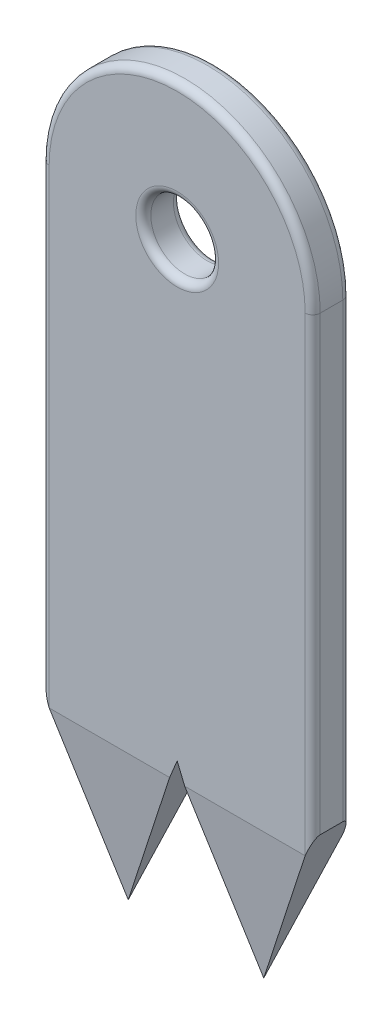
ISO-10303-21;
HEADER;
FILE_DESCRIPTION(('STEP AP214'),'2;1');
FILE_NAME('part.step','',(''),(''),'','','');
FILE_SCHEMA(('AUTOMOTIVE_DESIGN { 1 0 10303 214 1 1 1 1 }'));
ENDSEC;
DATA;
#1=APPLICATION_CONTEXT('core data for automotive mechanical design processes');
#2=APPLICATION_PROTOCOL_DEFINITION('international standard','automotive_design',2000,#1);
#3=PRODUCT_CONTEXT('',#1,'mechanical');
#4=PRODUCT('Part','Part','',(#3));
#5=PRODUCT_RELATED_PRODUCT_CATEGORY('part','',(#4));
#6=PRODUCT_DEFINITION_FORMATION('','',#4);
#7=PRODUCT_DEFINITION_CONTEXT('part definition',#1,'design');
#8=PRODUCT_DEFINITION('design','',#6,#7);
#9=PRODUCT_DEFINITION_SHAPE('','',#8);
#10=(LENGTH_UNIT() NAMED_UNIT(*) SI_UNIT(.MILLI.,.METRE.));
#11=(NAMED_UNIT(*) PLANE_ANGLE_UNIT() SI_UNIT($,.RADIAN.));
#12=(NAMED_UNIT(*) SI_UNIT($,.STERADIAN.) SOLID_ANGLE_UNIT());
#13=UNCERTAINTY_MEASURE_WITH_UNIT(LENGTH_MEASURE(1.E-05),#10,'distance_accuracy_value','');
#14=(GEOMETRIC_REPRESENTATION_CONTEXT(3) GLOBAL_UNCERTAINTY_ASSIGNED_CONTEXT((#13)) GLOBAL_UNIT_ASSIGNED_CONTEXT((#10,
#11,#12)) REPRESENTATION_CONTEXT('',''));
#15=CARTESIAN_POINT('',(0.,0.,0.));
#16=DIRECTION('',(0.,0.,1.));
#17=DIRECTION('',(1.,0.,0.));
#18=AXIS2_PLACEMENT_3D('',#15,#16,#17);
#19=CARTESIAN_POINT('',(-12.7588501154189,52.5652173913044,5.));
#20=DIRECTION('',(0.,0.,1.));
#21=DIRECTION('',(1.,0.,0.));
#22=AXIS2_PLACEMENT_3D('',#19,#20,#21);
#23=PLANE('',#22);
#24=DIRECTION('',(1.,0.,0.));
#25=VECTOR('',#24,1.);
#26=CARTESIAN_POINT('',(-30.7588501154189,-9.84899617106877,5.));
#27=LINE('',#26,#25);
#28=CARTESIAN_POINT('',(-11.7588501154189,-9.84899617106877,5.));
#29=VERTEX_POINT('',#28);
#30=CARTESIAN_POINT('',(4.24114988458109,-9.84899617106877,5.));
#31=VERTEX_POINT('',#30);
#32=EDGE_CURVE('E329',#29,#31,#27,.T.);
#33=ORIENTED_EDGE('',*,*,#32,.T.);
#34=DIRECTION('',(0.,1.,0.));
#35=VECTOR('',#34,1.);
#36=CARTESIAN_POINT('',(4.24114988458108,52.5652173913044,5.));
#37=LINE('',#36,#35);
#38=CARTESIAN_POINT('',(4.24114988458108,52.5652173913044,5.));
#39=VERTEX_POINT('',#38);
#40=EDGE_CURVE('E190',#31,#39,#37,.T.);
#41=ORIENTED_EDGE('',*,*,#40,.T.);
#42=CARTESIAN_POINT('',(-12.7588501154189,52.5652173913044,5.));
#43=DIRECTION('',(0.,0.,1.));
#44=DIRECTION('',(1.,0.,0.));
#45=AXIS2_PLACEMENT_3D('',#42,#43,#44);
#46=CIRCLE('',#45,17.);
#47=CARTESIAN_POINT('',(-29.7588501154189,52.5652173913044,5.));
#48=VERTEX_POINT('',#47);
#49=EDGE_CURVE('E54',#39,#48,#46,.T.);
#50=ORIENTED_EDGE('',*,*,#49,.T.);
#51=DIRECTION('',(0.,-1.,0.));
#52=VECTOR('',#51,1.);
#53=CARTESIAN_POINT('',(-29.7588501154189,-7.43478260869565,5.));
#54=LINE('',#53,#52);
#55=CARTESIAN_POINT('',(-29.7588501154189,-9.84899617106877,5.));
#56=VERTEX_POINT('',#55);
#57=EDGE_CURVE('E188',#48,#56,#54,.T.);
#58=ORIENTED_EDGE('',*,*,#57,.T.);
#59=CARTESIAN_POINT('',(-13.7588501154189,-9.84899617106877,5.));
#60=VERTEX_POINT('',#59);
#61=EDGE_CURVE('E331',#56,#60,#27,.T.);
#62=ORIENTED_EDGE('',*,*,#61,.T.);
#63=DIRECTION('',(0.382683432365087,0.923879532511288,0.));
#64=VECTOR('',#63,1.);
#65=CARTESIAN_POINT('',(-12.7588501154189,-7.43478260869565,5.));
#66=LINE('',#65,#64);
#67=CARTESIAN_POINT('',(-12.7588501154189,-7.43478260869565,5.));
#68=VERTEX_POINT('',#67);
#69=EDGE_CURVE('E215',#60,#68,#66,.T.);
#70=ORIENTED_EDGE('',*,*,#69,.T.);
#71=DIRECTION('',(0.382683432365087,-0.923879532511288,0.));
#72=VECTOR('',#71,1.);
#73=CARTESIAN_POINT('',(-12.7588501154189,-7.43478260869565,5.));
#74=LINE('',#73,#72);
#75=EDGE_CURVE('E217',#68,#29,#74,.T.);
#76=ORIENTED_EDGE('',*,*,#75,.T.);
#77=EDGE_LOOP('',(#33,#41,#50,#58,#62,#70,#76));
#78=FACE_BOUND('',#77,.T.);
#79=CARTESIAN_POINT('',(-12.7588501154189,52.5652173913044,5.));
#80=DIRECTION('',(0.,0.,1.));
#81=DIRECTION('',(1.,0.,0.));
#82=AXIS2_PLACEMENT_3D('',#79,#80,#81);
#83=CIRCLE('',#82,5.5);
#84=CARTESIAN_POINT('',(-7.25885011541891,52.5652173913044,5.));
#85=VERTEX_POINT('',#84);
#86=EDGE_CURVE('E160',#85,#85,#83,.F.);
#87=ORIENTED_EDGE('',*,*,#86,.T.);
#88=EDGE_LOOP('',(#87));
#89=FACE_BOUND('',#88,.T.);
#90=ADVANCED_FACE('F37',(#78,#89),#23,.T.);
#91=CARTESIAN_POINT('',(-12.7588501154189,52.5652173913044,0.));
#92=DIRECTION('',(0.,0.,1.));
#93=DIRECTION('',(1.,0.,0.));
#94=AXIS2_PLACEMENT_3D('',#91,#92,#93);
#95=PLANE('',#94);
#96=CARTESIAN_POINT('',(-12.7588501154189,52.5652173913044,0.));
#97=DIRECTION('',(0.,0.,1.));
#98=DIRECTION('',(1.,0.,0.));
#99=AXIS2_PLACEMENT_3D('',#96,#97,#98);
#100=CIRCLE('',#99,5.5);
#101=CARTESIAN_POINT('',(-7.25885011541891,52.5652173913044,0.));
#102=VERTEX_POINT('',#101);
#103=EDGE_CURVE('E172',#102,#102,#100,.T.);
#104=ORIENTED_EDGE('',*,*,#103,.T.);
#105=EDGE_LOOP('',(#104));
#106=FACE_BOUND('',#105,.T.);
#107=DIRECTION('',(0.,1.,0.));
#108=VECTOR('',#107,1.);
#109=CARTESIAN_POINT('',(4.24114988458108,52.5652173913044,0.));
#110=LINE('',#109,#108);
#111=CARTESIAN_POINT('',(4.24114988458108,52.5652173913044,0.));
#112=VERTEX_POINT('',#111);
#113=CARTESIAN_POINT('',(4.24114988458109,-9.84899617106877,0.));
#114=VERTEX_POINT('',#113);
#115=EDGE_CURVE('E167',#112,#114,#110,.F.);
#116=ORIENTED_EDGE('',*,*,#115,.T.);
#117=DIRECTION('',(1.,0.,0.));
#118=VECTOR('',#117,1.);
#119=CARTESIAN_POINT('',(-30.7588501154189,-9.84899617106873,0.));
#120=LINE('',#119,#118);
#121=CARTESIAN_POINT('',(-11.7588501154189,-9.84899617106873,0.));
#122=VERTEX_POINT('',#121);
#123=EDGE_CURVE('E150',#122,#114,#120,.T.);
#124=ORIENTED_EDGE('',*,*,#123,.F.);
#125=DIRECTION('',(0.382683432365087,-0.923879532511288,0.));
#126=VECTOR('',#125,1.);
#127=CARTESIAN_POINT('',(-12.7588501154189,-7.43478260869565,0.));
#128=LINE('',#127,#126);
#129=CARTESIAN_POINT('',(-12.7588501154189,-7.43478260869565,0.));
#130=VERTEX_POINT('',#129);
#131=EDGE_CURVE('E218',#130,#122,#128,.T.);
#132=ORIENTED_EDGE('',*,*,#131,.F.);
#133=DIRECTION('',(0.382683432365087,0.923879532511288,0.));
#134=VECTOR('',#133,1.);
#135=CARTESIAN_POINT('',(-12.7588501154189,-7.43478260869565,0.));
#136=LINE('',#135,#134);
#137=CARTESIAN_POINT('',(-13.7588501154189,-9.84899617106873,0.));
#138=VERTEX_POINT('',#137);
#139=EDGE_CURVE('E149',#138,#130,#136,.T.);
#140=ORIENTED_EDGE('',*,*,#139,.F.);
#141=CARTESIAN_POINT('',(-29.7588501154189,-9.84899617106873,0.));
#142=VERTEX_POINT('',#141);
#143=EDGE_CURVE('E133',#142,#138,#120,.T.);
#144=ORIENTED_EDGE('',*,*,#143,.F.);
#145=DIRECTION('',(0.,-1.,0.));
#146=VECTOR('',#145,1.);
#147=CARTESIAN_POINT('',(-29.7588501154189,52.5652173913044,0.));
#148=LINE('',#147,#146);
#149=CARTESIAN_POINT('',(-29.7588501154189,52.5652173913044,0.));
#150=VERTEX_POINT('',#149);
#151=EDGE_CURVE('E146',#142,#150,#148,.F.);
#152=ORIENTED_EDGE('',*,*,#151,.T.);
#153=CARTESIAN_POINT('',(-12.7588501154189,52.5652173913044,0.));
#154=DIRECTION('',(0.,0.,1.));
#155=DIRECTION('',(1.,0.,0.));
#156=AXIS2_PLACEMENT_3D('',#153,#154,#155);
#157=CIRCLE('',#156,17.);
#158=EDGE_CURVE('E168',#150,#112,#157,.F.);
#159=ORIENTED_EDGE('',*,*,#158,.T.);
#160=EDGE_LOOP('',(#116,#124,#132,#140,#144,#152,#159));
#161=FACE_BOUND('',#160,.T.);
#162=ADVANCED_FACE('F144',(#106,#161),#95,.F.);
#163=CARTESIAN_POINT('',(-12.7588501154189,-7.43478260869565,5.));
#164=DIRECTION('',(-0.923879532511288,0.382683432365087,0.));
#165=DIRECTION('',(-0.382683432365087,-0.923879532511288,0.));
#166=AXIS2_PLACEMENT_3D('',#163,#164,#165);
#167=PLANE('',#166);
#168=DIRECTION('',(-0.379975978808354,-0.917343161415128,-0.118742493377611));
#169=VECTOR('',#168,1.);
#170=CARTESIAN_POINT('',(-12.7729498951524,-7.46882248815482,5.30809381883327));
#171=LINE('',#170,#169);
#172=CARTESIAN_POINT('',(-21.7588501154189,-29.1627046700537,2.5));
#173=VERTEX_POINT('',#172);
#174=EDGE_CURVE('E211',#60,#173,#171,.T.);
#175=ORIENTED_EDGE('',*,*,#174,.T.);
#176=DIRECTION('',(0.379975978808354,0.917343161415128,-0.118742493377611));
#177=VECTOR('',#176,1.);
#178=CARTESIAN_POINT('',(-12.9985463708889,-8.01346055950148,-0.237594920165608));
#179=LINE('',#178,#177);
#180=EDGE_CURVE('E135',#173,#138,#179,.T.);
#181=ORIENTED_EDGE('',*,*,#180,.T.);
#182=ORIENTED_EDGE('',*,*,#139,.T.);
#183=DIRECTION('',(0.,0.,-1.));
#184=VECTOR('',#183,1.);
#185=CARTESIAN_POINT('',(-12.7588501154189,-7.43478260869565,5.));
#186=LINE('',#185,#184);
#187=EDGE_CURVE('E233',#68,#130,#186,.T.);
#188=ORIENTED_EDGE('',*,*,#187,.F.);
#189=ORIENTED_EDGE('',*,*,#69,.F.);
#190=EDGE_LOOP('',(#175,#181,#182,#188,#189));
#191=FACE_BOUND('',#190,.T.);
#192=ADVANCED_FACE('F263',(#191),#167,.F.);
#193=CARTESIAN_POINT('',(-12.7588501154189,-7.43478260869565,5.));
#194=DIRECTION('',(0.923879532511288,0.382683432365087,0.));
#195=DIRECTION('',(-0.382683432365087,0.923879532511288,0.));
#196=AXIS2_PLACEMENT_3D('',#193,#194,#195);
#197=PLANE('',#196);
#198=ORIENTED_EDGE('',*,*,#131,.T.);
#199=DIRECTION('',(0.379975978808354,-0.917343161415128,0.118742493377611));
#200=VECTOR('',#199,1.);
#201=CARTESIAN_POINT('',(-12.5191538599489,-8.01346055950148,-0.237594920165608));
#202=LINE('',#201,#200);
#203=CARTESIAN_POINT('',(-3.7588501154189,-29.1627046700537,2.5));
#204=VERTEX_POINT('',#203);
#205=EDGE_CURVE('E332',#122,#204,#202,.T.);
#206=ORIENTED_EDGE('',*,*,#205,.T.);
#207=DIRECTION('',(-0.379975978808354,0.917343161415128,0.118742493377611));
#208=VECTOR('',#207,1.);
#209=CARTESIAN_POINT('',(-12.7447503356854,-7.46882248815482,5.30809381883327));
#210=LINE('',#209,#208);
#211=EDGE_CURVE('E200',#204,#29,#210,.T.);
#212=ORIENTED_EDGE('',*,*,#211,.T.);
#213=ORIENTED_EDGE('',*,*,#75,.F.);
#214=ORIENTED_EDGE('',*,*,#187,.T.);
#215=EDGE_LOOP('',(#198,#206,#212,#213,#214));
#216=FACE_BOUND('',#215,.T.);
#217=ADVANCED_FACE('F288',(#216),#197,.F.);
#218=CARTESIAN_POINT('',(-3.7588501154189,-29.1627046700537,5.));
#219=DIRECTION('',(-0.923879532511288,0.382683432365087,0.));
#220=DIRECTION('',(-0.382683432365087,-0.923879532511288,0.));
#221=AXIS2_PLACEMENT_3D('',#218,#219,#220);
#222=PLANE('',#221);
#223=DIRECTION('',(-0.379975978808354,-0.917343161415128,-0.118742493377611));
#224=VECTOR('',#223,1.);
#225=CARTESIAN_POINT('',(-3.64605187755065,-28.8903856343803,2.53524944933383));
#226=LINE('',#225,#224);
#227=EDGE_CURVE('E203',#31,#204,#226,.T.);
#228=ORIENTED_EDGE('',*,*,#227,.T.);
#229=DIRECTION('',(0.379975978808354,0.917343161415128,-0.118742493377611));
#230=VECTOR('',#229,1.);
#231=CARTESIAN_POINT('',(-3.87164835328716,-29.435023705727,2.53524944933383));
#232=LINE('',#231,#230);
#233=EDGE_CURVE('E326',#204,#114,#232,.T.);
#234=ORIENTED_EDGE('',*,*,#233,.T.);
#235=CARTESIAN_POINT('',(4.24114988458109,-9.84899617106876,1.));
#236=DIRECTION('',(-0.923879532511288,0.382683432365087,0.));
#237=DIRECTION('',(0.382683432365087,0.923879532511288,0.));
#238=AXIS2_PLACEMENT_3D('',#235,#236,#237);
#239=ELLIPSE('',#238,2.61312592975277,1.);
#240=CARTESIAN_POINT('',(5.24114988458109,-7.43478260869565,1.));
#241=VERTEX_POINT('',#240);
#242=EDGE_CURVE('E178',#114,#241,#239,.F.);
#243=ORIENTED_EDGE('',*,*,#242,.T.);
#244=DIRECTION('',(0.,0.,-1.));
#245=VECTOR('',#244,1.);
#246=CARTESIAN_POINT('',(5.24114988458109,-7.43478260869565,5.));
#247=LINE('',#246,#245);
#248=CARTESIAN_POINT('',(5.24114988458109,-7.43478260869565,4.));
#249=VERTEX_POINT('',#248);
#250=EDGE_CURVE('E230',#249,#241,#247,.T.);
#251=ORIENTED_EDGE('',*,*,#250,.F.);
#252=CARTESIAN_POINT('',(4.24114988458109,-9.84899617106876,4.));
#253=DIRECTION('',(-0.923879532511288,0.382683432365087,0.));
#254=DIRECTION('',(-0.382683432365087,-0.923879532511288,0.));
#255=AXIS2_PLACEMENT_3D('',#252,#253,#254);
#256=ELLIPSE('',#255,2.61312592975277,1.);
#257=EDGE_CURVE('E170',#249,#31,#256,.F.);
#258=ORIENTED_EDGE('',*,*,#257,.T.);
#259=EDGE_LOOP('',(#228,#234,#243,#251,#258));
#260=FACE_BOUND('',#259,.T.);
#261=ADVANCED_FACE('F284',(#260),#222,.F.);
#262=CARTESIAN_POINT('',(5.24114988458109,52.5652173913044,5.));
#263=DIRECTION('',(-1.,0.,0.));
#264=DIRECTION('',(0.,-1.,0.));
#265=AXIS2_PLACEMENT_3D('',#262,#263,#264);
#266=PLANE('',#265);
#267=ORIENTED_EDGE('',*,*,#250,.T.);
#268=DIRECTION('',(0.,1.,0.));
#269=VECTOR('',#268,1.);
#270=CARTESIAN_POINT('',(5.24114988458109,52.5652173913044,1.));
#271=LINE('',#270,#269);
#272=CARTESIAN_POINT('',(5.24114988458108,52.5652173913044,1.));
#273=VERTEX_POINT('',#272);
#274=EDGE_CURVE('E238',#241,#273,#271,.T.);
#275=ORIENTED_EDGE('',*,*,#274,.T.);
#276=DIRECTION('',(0.,0.,-1.));
#277=VECTOR('',#276,1.);
#278=CARTESIAN_POINT('',(5.24114988458108,52.5652173913044,5.));
#279=LINE('',#278,#277);
#280=CARTESIAN_POINT('',(5.24114988458108,52.5652173913044,4.));
#281=VERTEX_POINT('',#280);
#282=EDGE_CURVE('E227',#281,#273,#279,.T.);
#283=ORIENTED_EDGE('',*,*,#282,.F.);
#284=DIRECTION('',(0.,1.,0.));
#285=VECTOR('',#284,1.);
#286=CARTESIAN_POINT('',(5.24114988458109,-7.43478260869565,4.));
#287=LINE('',#286,#285);
#288=EDGE_CURVE('E236',#281,#249,#287,.F.);
#289=ORIENTED_EDGE('',*,*,#288,.T.);
#290=EDGE_LOOP('',(#267,#275,#283,#289));
#291=FACE_BOUND('',#290,.T.);
#292=ADVANCED_FACE('F280',(#291),#266,.F.);
#293=CARTESIAN_POINT('',(-12.7588501154189,52.5652173913044,5.));
#294=DIRECTION('',(0.,0.,-1.));
#295=DIRECTION('',(-1.,0.,0.));
#296=AXIS2_PLACEMENT_3D('',#293,#294,#295);
#297=CYLINDRICAL_SURFACE('',#296,18.);
#298=ORIENTED_EDGE('',*,*,#282,.T.);
#299=CARTESIAN_POINT('',(-12.7588501154189,52.5652173913044,1.));
#300=DIRECTION('',(0.,0.,1.));
#301=DIRECTION('',(1.,0.,0.));
#302=AXIS2_PLACEMENT_3D('',#299,#300,#301);
#303=CIRCLE('',#302,18.);
#304=CARTESIAN_POINT('',(-30.7588501154189,52.5652173913044,1.));
#305=VERTEX_POINT('',#304);
#306=EDGE_CURVE('E194',#273,#305,#303,.T.);
#307=ORIENTED_EDGE('',*,*,#306,.T.);
#308=DIRECTION('',(0.,0.,-1.));
#309=VECTOR('',#308,1.);
#310=CARTESIAN_POINT('',(-30.7588501154189,52.5652173913044,5.));
#311=LINE('',#310,#309);
#312=CARTESIAN_POINT('',(-30.7588501154189,52.5652173913044,4.));
#313=VERTEX_POINT('',#312);
#314=EDGE_CURVE('E224',#313,#305,#311,.T.);
#315=ORIENTED_EDGE('',*,*,#314,.F.);
#316=CARTESIAN_POINT('',(-12.7588501154189,52.5652173913044,4.));
#317=DIRECTION('',(0.,0.,1.));
#318=DIRECTION('',(1.,0.,0.));
#319=AXIS2_PLACEMENT_3D('',#316,#317,#318);
#320=CIRCLE('',#319,18.);
#321=EDGE_CURVE('E192',#313,#281,#320,.F.);
#322=ORIENTED_EDGE('',*,*,#321,.T.);
#323=EDGE_LOOP('',(#298,#307,#315,#322));
#324=FACE_BOUND('',#323,.T.);
#325=ADVANCED_FACE('F276',(#324),#297,.T.);
#326=CARTESIAN_POINT('',(-30.7588501154189,-7.43478260869565,5.));
#327=DIRECTION('',(1.,0.,0.));
#328=DIRECTION('',(0.,0.,-1.));
#329=AXIS2_PLACEMENT_3D('',#326,#327,#328);
#330=PLANE('',#329);
#331=ORIENTED_EDGE('',*,*,#314,.T.);
#332=DIRECTION('',(0.,-1.,0.));
#333=VECTOR('',#332,1.);
#334=CARTESIAN_POINT('',(-30.7588501154189,-7.43478260869565,1.));
#335=LINE('',#334,#333);
#336=CARTESIAN_POINT('',(-30.7588501154189,-7.43478260869565,1.));
#337=VERTEX_POINT('',#336);
#338=EDGE_CURVE('E182',#305,#337,#335,.T.);
#339=ORIENTED_EDGE('',*,*,#338,.T.);
#340=DIRECTION('',(0.,0.,-1.));
#341=VECTOR('',#340,1.);
#342=CARTESIAN_POINT('',(-30.7588501154189,-7.43478260869565,5.));
#343=LINE('',#342,#341);
#344=CARTESIAN_POINT('',(-30.7588501154189,-7.43478260869565,4.));
#345=VERTEX_POINT('',#344);
#346=EDGE_CURVE('E157',#345,#337,#343,.T.);
#347=ORIENTED_EDGE('',*,*,#346,.F.);
#348=DIRECTION('',(0.,-1.,0.));
#349=VECTOR('',#348,1.);
#350=CARTESIAN_POINT('',(-30.7588501154189,52.5652173913044,4.));
#351=LINE('',#350,#349);
#352=EDGE_CURVE('E180',#345,#313,#351,.F.);
#353=ORIENTED_EDGE('',*,*,#352,.T.);
#354=EDGE_LOOP('',(#331,#339,#347,#353));
#355=FACE_BOUND('',#354,.T.);
#356=ADVANCED_FACE('F273',(#355),#330,.F.);
#357=CARTESIAN_POINT('',(-21.7588501154189,-29.1627046700537,5.));
#358=DIRECTION('',(0.923879532511288,0.382683432365087,0.));
#359=DIRECTION('',(-0.382683432365087,0.923879532511288,0.));
#360=AXIS2_PLACEMENT_3D('',#357,#358,#359);
#361=PLANE('',#360);
#362=CARTESIAN_POINT('',(-29.7588501154189,-9.84899617106876,1.));
#363=DIRECTION('',(0.923879532511288,0.382683432365087,0.));
#364=DIRECTION('',(0.382683432365087,-0.923879532511288,0.));
#365=AXIS2_PLACEMENT_3D('',#362,#363,#364);
#366=ELLIPSE('',#365,2.61312592975277,1.);
#367=EDGE_CURVE('E154',#337,#142,#366,.F.);
#368=ORIENTED_EDGE('',*,*,#367,.T.);
#369=DIRECTION('',(0.379975978808354,-0.917343161415128,0.118742493377611));
#370=VECTOR('',#369,1.);
#371=CARTESIAN_POINT('',(-21.6460518775507,-29.435023705727,2.53524944933383));
#372=LINE('',#371,#370);
#373=EDGE_CURVE('E130',#142,#173,#372,.T.);
#374=ORIENTED_EDGE('',*,*,#373,.T.);
#375=DIRECTION('',(-0.379975978808354,0.917343161415128,0.118742493377611));
#376=VECTOR('',#375,1.);
#377=CARTESIAN_POINT('',(-21.8716483532872,-28.8903856343803,2.53524944933383));
#378=LINE('',#377,#376);
#379=EDGE_CURVE('E315',#173,#56,#378,.T.);
#380=ORIENTED_EDGE('',*,*,#379,.T.);
#381=CARTESIAN_POINT('',(-29.7588501154189,-9.84899617106877,4.));
#382=DIRECTION('',(0.923879532511288,0.382683432365087,0.));
#383=DIRECTION('',(-0.382683432365087,0.923879532511288,0.));
#384=AXIS2_PLACEMENT_3D('',#381,#382,#383);
#385=ELLIPSE('',#384,2.61312592975277,1.);
#386=EDGE_CURVE('E161',#56,#345,#385,.F.);
#387=ORIENTED_EDGE('',*,*,#386,.T.);
#388=ORIENTED_EDGE('',*,*,#346,.T.);
#389=EDGE_LOOP('',(#368,#374,#380,#387,#388));
#390=FACE_BOUND('',#389,.T.);
#391=ADVANCED_FACE('F155',(#390),#361,.F.);
#392=CARTESIAN_POINT('',(-12.7588501154189,52.5652173913044,5.));
#393=DIRECTION('',(0.,0.,-1.));
#394=DIRECTION('',(-1.,0.,0.));
#395=AXIS2_PLACEMENT_3D('',#392,#393,#394);
#396=CYLINDRICAL_SURFACE('',#395,4.5);
#397=CARTESIAN_POINT('',(-12.7588501154189,52.5652173913044,1.));
#398=DIRECTION('',(0.,0.,1.));
#399=DIRECTION('',(1.,0.,0.));
#400=AXIS2_PLACEMENT_3D('',#397,#398,#399);
#401=CIRCLE('',#400,4.5);
#402=CARTESIAN_POINT('',(-8.25885011541891,52.5652173913044,1.));
#403=VERTEX_POINT('',#402);
#404=EDGE_CURVE('E11',#403,#403,#401,.F.);
#405=ORIENTED_EDGE('',*,*,#404,.T.);
#406=EDGE_LOOP('',(#405));
#407=FACE_BOUND('',#406,.T.);
#408=CARTESIAN_POINT('',(-12.7588501154189,52.5652173913044,4.));
#409=DIRECTION('',(0.,0.,1.));
#410=DIRECTION('',(1.,0.,0.));
#411=AXIS2_PLACEMENT_3D('',#408,#409,#410);
#412=CIRCLE('',#411,4.5);
#413=CARTESIAN_POINT('',(-8.25885011541891,52.5652173913044,4.));
#414=VERTEX_POINT('',#413);
#415=EDGE_CURVE('E46',#414,#414,#412,.T.);
#416=ORIENTED_EDGE('',*,*,#415,.T.);
#417=EDGE_LOOP('',(#416));
#418=FACE_BOUND('',#417,.T.);
#419=ADVANCED_FACE('F268',(#407,#418),#396,.F.);
#420=CARTESIAN_POINT('',(-29.7588501154189,-7.43478260869565,1.));
#421=DIRECTION('',(0.,-1.,0.));
#422=DIRECTION('',(0.,0.,-1.));
#423=AXIS2_PLACEMENT_3D('',#420,#421,#422);
#424=CYLINDRICAL_SURFACE('',#423,1.);
#425=ORIENTED_EDGE('',*,*,#367,.F.);
#426=ORIENTED_EDGE('',*,*,#338,.F.);
#427=CARTESIAN_POINT('',(-29.7588501154189,52.5652173913044,1.));
#428=DIRECTION('',(0.,1.,0.));
#429=DIRECTION('',(0.,0.,1.));
#430=AXIS2_PLACEMENT_3D('',#427,#428,#429);
#431=CIRCLE('',#430,1.);
#432=EDGE_CURVE('E165',#150,#305,#431,.T.);
#433=ORIENTED_EDGE('',*,*,#432,.F.);
#434=ORIENTED_EDGE('',*,*,#151,.F.);
#435=EDGE_LOOP('',(#425,#426,#433,#434));
#436=FACE_BOUND('',#435,.T.);
#437=ADVANCED_FACE('F163',(#436),#424,.T.);
#438=CARTESIAN_POINT('',(-12.7588501154189,52.5652173913044,1.));
#439=DIRECTION('',(0.,0.,1.));
#440=DIRECTION('',(1.,0.,0.));
#441=AXIS2_PLACEMENT_3D('',#438,#439,#440);
#442=TOROIDAL_SURFACE('',#441,17.,1.);
#443=ORIENTED_EDGE('',*,*,#432,.T.);
#444=ORIENTED_EDGE('',*,*,#306,.F.);
#445=CARTESIAN_POINT('',(4.24114988458108,52.5652173913044,1.));
#446=DIRECTION('',(0.,-1.,0.));
#447=DIRECTION('',(0.,0.,-1.));
#448=AXIS2_PLACEMENT_3D('',#445,#446,#447);
#449=CIRCLE('',#448,1.);
#450=EDGE_CURVE('E198',#112,#273,#449,.T.);
#451=ORIENTED_EDGE('',*,*,#450,.F.);
#452=ORIENTED_EDGE('',*,*,#158,.F.);
#453=EDGE_LOOP('',(#443,#444,#451,#452));
#454=FACE_BOUND('',#453,.T.);
#455=ADVANCED_FACE('F299',(#454),#442,.T.);
#456=CARTESIAN_POINT('',(4.24114988458109,52.5652173913044,1.));
#457=DIRECTION('',(0.,1.,0.));
#458=DIRECTION('',(-1.,0.,0.));
#459=AXIS2_PLACEMENT_3D('',#456,#457,#458);
#460=CYLINDRICAL_SURFACE('',#459,1.);
#461=ORIENTED_EDGE('',*,*,#242,.F.);
#462=ORIENTED_EDGE('',*,*,#115,.F.);
#463=ORIENTED_EDGE('',*,*,#450,.T.);
#464=ORIENTED_EDGE('',*,*,#274,.F.);
#465=EDGE_LOOP('',(#461,#462,#463,#464));
#466=FACE_BOUND('',#465,.T.);
#467=ADVANCED_FACE('F295',(#466),#460,.T.);
#468=CARTESIAN_POINT('',(-29.7588501154189,52.5652173913044,4.));
#469=DIRECTION('',(0.,1.,0.));
#470=DIRECTION('',(0.,0.,1.));
#471=AXIS2_PLACEMENT_3D('',#468,#469,#470);
#472=CYLINDRICAL_SURFACE('',#471,1.);
#473=ORIENTED_EDGE('',*,*,#386,.F.);
#474=ORIENTED_EDGE('',*,*,#57,.F.);
#475=CARTESIAN_POINT('',(-29.7588501154189,52.5652173913044,4.));
#476=DIRECTION('',(0.,1.,0.));
#477=DIRECTION('',(0.,0.,1.));
#478=AXIS2_PLACEMENT_3D('',#475,#476,#477);
#479=CIRCLE('',#478,1.);
#480=EDGE_CURVE('E41',#313,#48,#479,.T.);
#481=ORIENTED_EDGE('',*,*,#480,.F.);
#482=ORIENTED_EDGE('',*,*,#352,.F.);
#483=EDGE_LOOP('',(#473,#474,#481,#482));
#484=FACE_BOUND('',#483,.T.);
#485=ADVANCED_FACE('F298',(#484),#472,.T.);
#486=CARTESIAN_POINT('',(-12.7588501154189,52.5652173913044,4.));
#487=DIRECTION('',(0.,0.,1.));
#488=DIRECTION('',(1.,0.,0.));
#489=AXIS2_PLACEMENT_3D('',#486,#487,#488);
#490=TOROIDAL_SURFACE('',#489,17.,1.);
#491=ORIENTED_EDGE('',*,*,#480,.T.);
#492=ORIENTED_EDGE('',*,*,#49,.F.);
#493=CARTESIAN_POINT('',(4.24114988458108,52.5652173913044,4.));
#494=DIRECTION('',(0.,-1.,0.));
#495=DIRECTION('',(0.,0.,-1.));
#496=AXIS2_PLACEMENT_3D('',#493,#494,#495);
#497=CIRCLE('',#496,1.);
#498=EDGE_CURVE('E62',#281,#39,#497,.T.);
#499=ORIENTED_EDGE('',*,*,#498,.F.);
#500=ORIENTED_EDGE('',*,*,#321,.F.);
#501=EDGE_LOOP('',(#491,#492,#499,#500));
#502=FACE_BOUND('',#501,.T.);
#503=ADVANCED_FACE('F254',(#502),#490,.T.);
#504=CARTESIAN_POINT('',(4.24114988458108,52.5652173913044,4.));
#505=DIRECTION('',(0.,-1.,0.));
#506=DIRECTION('',(1.,0.,0.));
#507=AXIS2_PLACEMENT_3D('',#504,#505,#506);
#508=CYLINDRICAL_SURFACE('',#507,1.);
#509=ORIENTED_EDGE('',*,*,#257,.F.);
#510=ORIENTED_EDGE('',*,*,#288,.F.);
#511=ORIENTED_EDGE('',*,*,#498,.T.);
#512=ORIENTED_EDGE('',*,*,#40,.F.);
#513=EDGE_LOOP('',(#509,#510,#511,#512));
#514=FACE_BOUND('',#513,.T.);
#515=ADVANCED_FACE('F246',(#514),#508,.T.);
#516=CARTESIAN_POINT('',(-12.7588501154189,52.5652173913044,1.));
#517=DIRECTION('',(0.,0.,1.));
#518=DIRECTION('',(1.,0.,0.));
#519=AXIS2_PLACEMENT_3D('',#516,#517,#518);
#520=TOROIDAL_SURFACE('',#519,5.5,1.);
#521=ORIENTED_EDGE('',*,*,#404,.F.);
#522=EDGE_LOOP('',(#521));
#523=FACE_BOUND('',#522,.T.);
#524=ORIENTED_EDGE('',*,*,#103,.F.);
#525=EDGE_LOOP('',(#524));
#526=FACE_BOUND('',#525,.T.);
#527=ADVANCED_FACE('F244',(#523,#526),#520,.T.);
#528=CARTESIAN_POINT('',(-12.7588501154189,52.5652173913044,4.));
#529=DIRECTION('',(0.,0.,1.));
#530=DIRECTION('',(1.,0.,0.));
#531=AXIS2_PLACEMENT_3D('',#528,#529,#530);
#532=TOROIDAL_SURFACE('',#531,5.5,1.);
#533=ORIENTED_EDGE('',*,*,#86,.F.);
#534=EDGE_LOOP('',(#533));
#535=FACE_BOUND('',#534,.T.);
#536=ORIENTED_EDGE('',*,*,#415,.F.);
#537=EDGE_LOOP('',(#536));
#538=FACE_BOUND('',#537,.T.);
#539=ADVANCED_FACE('F39',(#535,#538),#532,.T.);
#540=CARTESIAN_POINT('',(-30.7588501154189,-29.1627046700537,2.5));
#541=DIRECTION('',(0.,0.128370769053769,-0.991726245318003));
#542=DIRECTION('',(0.,0.991726245318003,0.128370769053769));
#543=AXIS2_PLACEMENT_3D('',#540,#541,#542);
#544=PLANE('',#543);
#545=ORIENTED_EDGE('',*,*,#61,.F.);
#546=ORIENTED_EDGE('',*,*,#379,.F.);
#547=ORIENTED_EDGE('',*,*,#174,.F.);
#548=EDGE_LOOP('',(#545,#546,#547));
#549=FACE_BOUND('',#548,.T.);
#550=ADVANCED_FACE('F252',(#549),#544,.F.);
#551=ORIENTED_EDGE('',*,*,#227,.F.);
#552=ORIENTED_EDGE('',*,*,#32,.F.);
#553=ORIENTED_EDGE('',*,*,#211,.F.);
#554=EDGE_LOOP('',(#551,#552,#553));
#555=FACE_BOUND('',#554,.T.);
#556=ADVANCED_FACE('F334',(#555),#544,.F.);
#557=CARTESIAN_POINT('',(-30.7588501154189,-29.1627046700537,2.5));
#558=DIRECTION('',(0.,0.128370769053769,0.991726245318003));
#559=DIRECTION('',(0.,-0.991726245318003,0.128370769053769));
#560=AXIS2_PLACEMENT_3D('',#557,#558,#559);
#561=PLANE('',#560);
#562=ORIENTED_EDGE('',*,*,#373,.F.);
#563=ORIENTED_EDGE('',*,*,#143,.T.);
#564=ORIENTED_EDGE('',*,*,#180,.F.);
#565=EDGE_LOOP('',(#562,#563,#564));
#566=FACE_BOUND('',#565,.T.);
#567=ADVANCED_FACE('F132',(#566),#561,.F.);
#568=ORIENTED_EDGE('',*,*,#123,.T.);
#569=ORIENTED_EDGE('',*,*,#233,.F.);
#570=ORIENTED_EDGE('',*,*,#205,.F.);
#571=EDGE_LOOP('',(#568,#569,#570));
#572=FACE_BOUND('',#571,.T.);
#573=ADVANCED_FACE('F340',(#572),#561,.F.);
#574=CLOSED_SHELL('',(#90,#162,#192,#217,#261,#292,#325,#356,#391,#419,#437,#455,#467,#485,#503,
#515,#527,#539,#550,#556,#567,#573));
#575=MANIFOLD_SOLID_BREP('B2',#574);
#576=ADVANCED_BREP_SHAPE_REPRESENTATION('',(#18,#575),#14);
#577=SHAPE_DEFINITION_REPRESENTATION(#9,#576);
ENDSEC;
END-ISO-10303-21;
